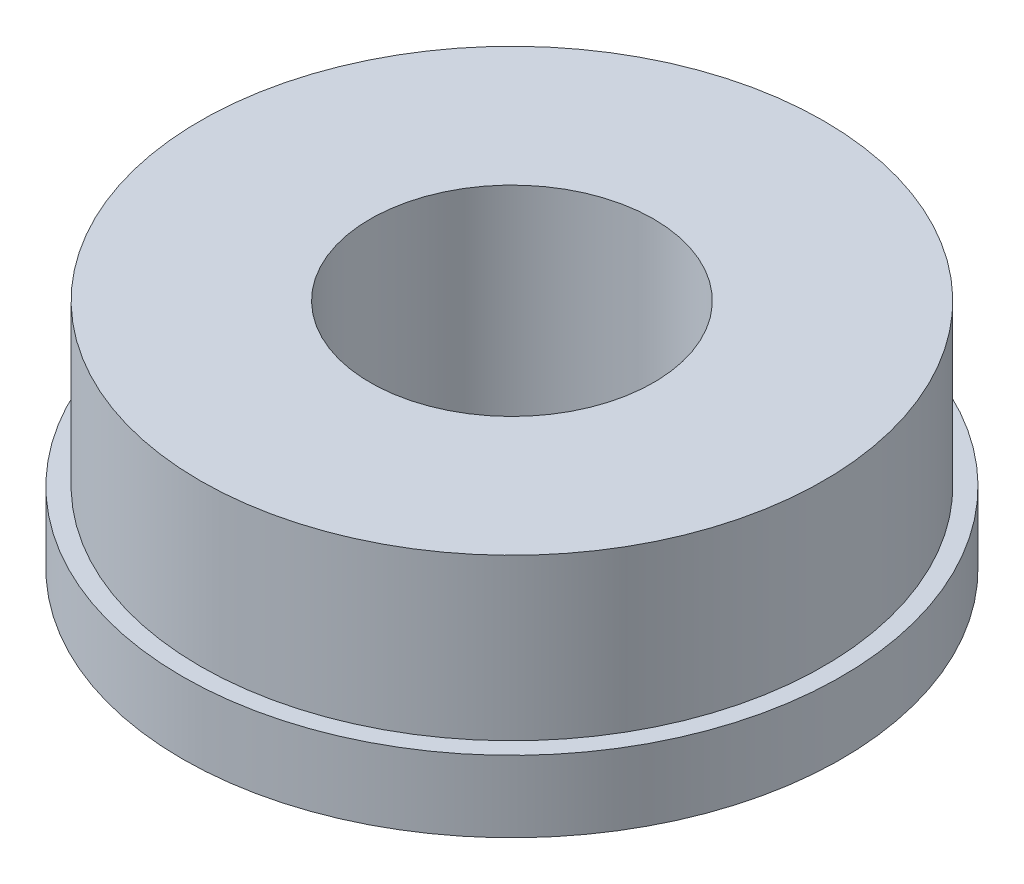
ISO-10303-21;
HEADER;
FILE_DESCRIPTION(('STEP AP214'),'2;1');
FILE_NAME('part.step','',(''),(''),'','','');
FILE_SCHEMA(('AUTOMOTIVE_DESIGN { 1 0 10303 214 1 1 1 1 }'));
ENDSEC;
DATA;
#1=APPLICATION_CONTEXT('core data for automotive mechanical design processes');
#2=APPLICATION_PROTOCOL_DEFINITION('international standard','automotive_design',2000,#1);
#3=PRODUCT_CONTEXT('',#1,'mechanical');
#4=PRODUCT('Part','Part','',(#3));
#5=PRODUCT_RELATED_PRODUCT_CATEGORY('part','',(#4));
#6=PRODUCT_DEFINITION_FORMATION('','',#4);
#7=PRODUCT_DEFINITION_CONTEXT('part definition',#1,'design');
#8=PRODUCT_DEFINITION('design','',#6,#7);
#9=PRODUCT_DEFINITION_SHAPE('','',#8);
#10=(LENGTH_UNIT() NAMED_UNIT(*) SI_UNIT(.MILLI.,.METRE.));
#11=(NAMED_UNIT(*) PLANE_ANGLE_UNIT() SI_UNIT($,.RADIAN.));
#12=(NAMED_UNIT(*) SI_UNIT($,.STERADIAN.) SOLID_ANGLE_UNIT());
#13=UNCERTAINTY_MEASURE_WITH_UNIT(LENGTH_MEASURE(1.E-05),#10,'distance_accuracy_value','');
#14=(GEOMETRIC_REPRESENTATION_CONTEXT(3) GLOBAL_UNCERTAINTY_ASSIGNED_CONTEXT((#13)) GLOBAL_UNIT_ASSIGNED_CONTEXT((#10,
#11,#12)) REPRESENTATION_CONTEXT('',''));
#15=CARTESIAN_POINT('',(0.,0.,0.));
#16=DIRECTION('',(0.,0.,1.));
#17=DIRECTION('',(1.,0.,0.));
#18=AXIS2_PLACEMENT_3D('',#15,#16,#17);
#19=CARTESIAN_POINT('',(0.,13.,0.));
#20=DIRECTION('',(0.,1.,0.));
#21=DIRECTION('',(0.,0.,1.));
#22=AXIS2_PLACEMENT_3D('',#19,#20,#21);
#23=PLANE('',#22);
#24=CARTESIAN_POINT('',(0.,13.,0.));
#25=DIRECTION('',(0.,1.,0.));
#26=DIRECTION('',(0.,0.,1.));
#27=AXIS2_PLACEMENT_3D('',#24,#25,#26);
#28=CIRCLE('',#27,17.465);
#29=CARTESIAN_POINT('',(0.,13.,-17.465));
#30=VERTEX_POINT('',#29);
#31=EDGE_CURVE('E10',#30,#30,#28,.T.);
#32=ORIENTED_EDGE('',*,*,#31,.T.);
#33=EDGE_LOOP('',(#32));
#34=FACE_BOUND('',#33,.T.);
#35=CARTESIAN_POINT('',(0.,13.,0.));
#36=DIRECTION('',(0.,1.,0.));
#37=DIRECTION('',(0.,0.,1.));
#38=AXIS2_PLACEMENT_3D('',#35,#36,#37);
#39=CIRCLE('',#38,7.94);
#40=CARTESIAN_POINT('',(0.,13.,-7.94));
#41=VERTEX_POINT('',#40);
#42=EDGE_CURVE('E42',#41,#41,#39,.T.);
#43=ORIENTED_EDGE('',*,*,#42,.F.);
#44=EDGE_LOOP('',(#43));
#45=FACE_BOUND('',#44,.T.);
#46=ADVANCED_FACE('F40',(#34,#45),#23,.T.);
#47=CARTESIAN_POINT('',(0.,0.,0.));
#48=DIRECTION('',(0.,1.,0.));
#49=DIRECTION('',(0.,0.,1.));
#50=AXIS2_PLACEMENT_3D('',#47,#48,#49);
#51=PLANE('',#50);
#52=CARTESIAN_POINT('',(0.,0.,0.));
#53=DIRECTION('',(0.,1.,0.));
#54=DIRECTION('',(0.,0.,1.));
#55=AXIS2_PLACEMENT_3D('',#52,#53,#54);
#56=CIRCLE('',#55,7.94);
#57=CARTESIAN_POINT('',(0.,0.,-7.94));
#58=VERTEX_POINT('',#57);
#59=EDGE_CURVE('E48',#58,#58,#56,.T.);
#60=ORIENTED_EDGE('',*,*,#59,.T.);
#61=EDGE_LOOP('',(#60));
#62=FACE_BOUND('',#61,.T.);
#63=CARTESIAN_POINT('',(0.,0.,0.));
#64=DIRECTION('',(0.,1.,0.));
#65=DIRECTION('',(0.,0.,1.));
#66=AXIS2_PLACEMENT_3D('',#63,#64,#65);
#67=CIRCLE('',#66,18.465);
#68=CARTESIAN_POINT('',(0.,0.,18.465));
#69=VERTEX_POINT('',#68);
#70=EDGE_CURVE('E59',#69,#69,#67,.T.);
#71=ORIENTED_EDGE('',*,*,#70,.F.);
#72=EDGE_LOOP('',(#71));
#73=FACE_BOUND('',#72,.T.);
#74=ADVANCED_FACE('F71',(#62,#73),#51,.F.);
#75=CARTESIAN_POINT('',(0.,13.,0.));
#76=DIRECTION('',(0.,-1.,0.));
#77=DIRECTION('',(0.,0.,-1.));
#78=AXIS2_PLACEMENT_3D('',#75,#76,#77);
#79=CYLINDRICAL_SURFACE('',#78,17.465);
#80=CARTESIAN_POINT('',(0.,4.,0.));
#81=DIRECTION('',(0.,1.,0.));
#82=DIRECTION('',(0.,0.,1.));
#83=AXIS2_PLACEMENT_3D('',#80,#81,#82);
#84=CIRCLE('',#83,17.465);
#85=CARTESIAN_POINT('',(0.,4.,-17.465));
#86=VERTEX_POINT('',#85);
#87=EDGE_CURVE('E52',#86,#86,#84,.T.);
#88=CARTESIAN_POINT('',(0.,4.,-17.465));
#89=CARTESIAN_POINT('',(0.,4.09375,-17.465));
#90=CARTESIAN_POINT('',(0.,4.1875,-17.465));
#91=CARTESIAN_POINT('',(0.,4.375,-17.465));
#92=CARTESIAN_POINT('',(0.,4.46875,-17.465));
#93=CARTESIAN_POINT('',(0.,4.65625,-17.465));
#94=CARTESIAN_POINT('',(0.,4.75,-17.465));
#95=CARTESIAN_POINT('',(0.,4.9375,-17.465));
#96=CARTESIAN_POINT('',(0.,5.03125,-17.465));
#97=CARTESIAN_POINT('',(0.,5.21875,-17.465));
#98=CARTESIAN_POINT('',(0.,5.3125,-17.465));
#99=CARTESIAN_POINT('',(0.,5.5,-17.465));
#100=CARTESIAN_POINT('',(0.,5.59375,-17.465));
#101=CARTESIAN_POINT('',(0.,5.78125,-17.465));
#102=CARTESIAN_POINT('',(0.,5.875,-17.465));
#103=CARTESIAN_POINT('',(0.,6.0625,-17.465));
#104=CARTESIAN_POINT('',(0.,6.15625,-17.465));
#105=CARTESIAN_POINT('',(0.,6.34375,-17.465));
#106=CARTESIAN_POINT('',(0.,6.4375,-17.465));
#107=CARTESIAN_POINT('',(0.,6.625,-17.465));
#108=CARTESIAN_POINT('',(0.,6.71875,-17.465));
#109=CARTESIAN_POINT('',(0.,6.90625,-17.465));
#110=CARTESIAN_POINT('',(0.,7.,-17.465));
#111=CARTESIAN_POINT('',(0.,7.1875,-17.465));
#112=CARTESIAN_POINT('',(0.,7.28125,-17.465));
#113=CARTESIAN_POINT('',(0.,7.46875,-17.465));
#114=CARTESIAN_POINT('',(0.,7.5625,-17.465));
#115=CARTESIAN_POINT('',(0.,7.75,-17.465));
#116=CARTESIAN_POINT('',(0.,7.84375,-17.465));
#117=CARTESIAN_POINT('',(0.,8.03125,-17.465));
#118=CARTESIAN_POINT('',(0.,8.125,-17.465));
#119=CARTESIAN_POINT('',(0.,8.3125,-17.465));
#120=CARTESIAN_POINT('',(0.,8.40625,-17.465));
#121=CARTESIAN_POINT('',(0.,8.59375,-17.465));
#122=CARTESIAN_POINT('',(0.,8.6875,-17.465));
#123=CARTESIAN_POINT('',(0.,8.875,-17.465));
#124=CARTESIAN_POINT('',(0.,8.96875,-17.465));
#125=CARTESIAN_POINT('',(0.,9.15625,-17.465));
#126=CARTESIAN_POINT('',(0.,9.25,-17.465));
#127=CARTESIAN_POINT('',(0.,9.4375,-17.465));
#128=CARTESIAN_POINT('',(0.,9.53125,-17.465));
#129=CARTESIAN_POINT('',(0.,9.71875,-17.465));
#130=CARTESIAN_POINT('',(0.,9.8125,-17.465));
#131=CARTESIAN_POINT('',(0.,10.,-17.465));
#132=CARTESIAN_POINT('',(0.,10.09375,-17.465));
#133=CARTESIAN_POINT('',(0.,10.28125,-17.465));
#134=CARTESIAN_POINT('',(0.,10.375,-17.465));
#135=CARTESIAN_POINT('',(0.,10.5625,-17.465));
#136=CARTESIAN_POINT('',(0.,10.65625,-17.465));
#137=CARTESIAN_POINT('',(0.,10.84375,-17.465));
#138=CARTESIAN_POINT('',(0.,10.9375,-17.465));
#139=CARTESIAN_POINT('',(0.,11.125,-17.465));
#140=CARTESIAN_POINT('',(0.,11.21875,-17.465));
#141=CARTESIAN_POINT('',(0.,11.40625,-17.465));
#142=CARTESIAN_POINT('',(0.,11.5,-17.465));
#143=CARTESIAN_POINT('',(0.,11.6875,-17.465));
#144=CARTESIAN_POINT('',(0.,11.78125,-17.465));
#145=CARTESIAN_POINT('',(0.,11.96875,-17.465));
#146=CARTESIAN_POINT('',(0.,12.0625,-17.465));
#147=CARTESIAN_POINT('',(0.,12.25,-17.465));
#148=CARTESIAN_POINT('',(0.,12.34375,-17.465));
#149=CARTESIAN_POINT('',(0.,12.53125,-17.465));
#150=CARTESIAN_POINT('',(0.,12.625,-17.465));
#151=CARTESIAN_POINT('',(0.,12.8125,-17.465));
#152=CARTESIAN_POINT('',(0.,12.90625,-17.465));
#153=CARTESIAN_POINT('',(0.,13.,-17.465));
#154=B_SPLINE_CURVE_WITH_KNOTS('',3,(#88,#89,#90,#91,#92,#93,#94,#95,#96,#97,#98,#99,#100,#101,
#102,#103,#104,#105,#106,#107,#108,#109,#110,#111,#112,#113,#114,#115,#116,#117,#118,#119,#120,
#121,#122,#123,#124,#125,#126,#127,#128,#129,#130,#131,#132,#133,#134,#135,#136,#137,#138,#139,
#140,#141,#142,#143,#144,#145,#146,#147,#148,#149,#150,#151,#152,#153),.UNSPECIFIED.,.F.,.F.,(4,
2,2,2,2,2,2,2,2,2,2,2,2,2,2,2,2,2,2,2,2,2,2,2,2,2,2,2,2,2,2,2,4),(0.,0.28125,0.5625,
0.843750000000001,1.125,1.40625,1.6875,1.96875,2.25,2.53125,2.8125,3.09375,3.375,3.65625,3.9375,
4.21875,4.5,4.78125,5.0625,5.34375,5.625,5.90625,6.1875,6.46875,6.75,7.03125,7.3125,7.59375,
7.875,8.15625,8.4375,8.71875,9.),.UNSPECIFIED.);
#155=EDGE_CURVE('BSEAM39',#86,#30,#154,.T.);
#156=ORIENTED_EDGE('',*,*,#87,.T.);
#157=ORIENTED_EDGE('',*,*,#31,.F.);
#158=ORIENTED_EDGE('',*,*,#155,.T.);
#159=ORIENTED_EDGE('',*,*,#155,.F.);
#160=EDGE_LOOP('',(#156,#158,#157,#159));
#161=FACE_BOUND('',#160,.T.);
#162=ADVANCED_FACE('F39',(#161),#79,.T.);
#163=CARTESIAN_POINT('',(0.,13.,0.));
#164=DIRECTION('',(0.,-1.,0.));
#165=DIRECTION('',(0.,0.,-1.));
#166=AXIS2_PLACEMENT_3D('',#163,#164,#165);
#167=CYLINDRICAL_SURFACE('',#166,7.94);
#168=CARTESIAN_POINT('',(0.,13.,-7.94));
#169=CARTESIAN_POINT('',(0.,12.8645833333333,-7.94));
#170=CARTESIAN_POINT('',(0.,12.7291666666667,-7.94));
#171=CARTESIAN_POINT('',(0.,12.4583333333333,-7.94));
#172=CARTESIAN_POINT('',(0.,12.3229166666667,-7.94));
#173=CARTESIAN_POINT('',(0.,12.0520833333333,-7.94));
#174=CARTESIAN_POINT('',(0.,11.9166666666667,-7.94));
#175=CARTESIAN_POINT('',(0.,11.6458333333333,-7.94));
#176=CARTESIAN_POINT('',(0.,11.5104166666667,-7.94));
#177=CARTESIAN_POINT('',(0.,11.2395833333333,-7.94));
#178=CARTESIAN_POINT('',(0.,11.1041666666667,-7.94));
#179=CARTESIAN_POINT('',(0.,10.8333333333333,-7.94));
#180=CARTESIAN_POINT('',(0.,10.6979166666667,-7.94));
#181=CARTESIAN_POINT('',(0.,10.4270833333333,-7.94));
#182=CARTESIAN_POINT('',(0.,10.2916666666667,-7.94));
#183=CARTESIAN_POINT('',(0.,10.0208333333333,-7.94));
#184=CARTESIAN_POINT('',(0.,9.88541666666667,-7.94));
#185=CARTESIAN_POINT('',(0.,9.61458333333333,-7.94));
#186=CARTESIAN_POINT('',(0.,9.47916666666667,-7.94));
#187=CARTESIAN_POINT('',(0.,9.20833333333333,-7.94));
#188=CARTESIAN_POINT('',(0.,9.07291666666666,-7.94));
#189=CARTESIAN_POINT('',(0.,8.80208333333333,-7.94));
#190=CARTESIAN_POINT('',(0.,8.66666666666667,-7.94));
#191=CARTESIAN_POINT('',(0.,8.39583333333333,-7.94));
#192=CARTESIAN_POINT('',(0.,8.26041666666667,-7.94));
#193=CARTESIAN_POINT('',(0.,7.98958333333333,-7.94));
#194=CARTESIAN_POINT('',(0.,7.85416666666667,-7.94));
#195=CARTESIAN_POINT('',(0.,7.58333333333333,-7.94));
#196=CARTESIAN_POINT('',(0.,7.44791666666667,-7.94));
#197=CARTESIAN_POINT('',(0.,7.17708333333333,-7.94));
#198=CARTESIAN_POINT('',(0.,7.04166666666667,-7.94));
#199=CARTESIAN_POINT('',(0.,6.77083333333333,-7.94));
#200=CARTESIAN_POINT('',(0.,6.63541666666667,-7.94));
#201=CARTESIAN_POINT('',(0.,6.36458333333333,-7.94));
#202=CARTESIAN_POINT('',(0.,6.22916666666667,-7.94));
#203=CARTESIAN_POINT('',(0.,5.95833333333333,-7.94));
#204=CARTESIAN_POINT('',(0.,5.82291666666667,-7.94));
#205=CARTESIAN_POINT('',(0.,5.55208333333333,-7.94));
#206=CARTESIAN_POINT('',(0.,5.41666666666667,-7.94));
#207=CARTESIAN_POINT('',(0.,5.14583333333333,-7.94));
#208=CARTESIAN_POINT('',(0.,5.01041666666667,-7.94));
#209=CARTESIAN_POINT('',(0.,4.73958333333333,-7.94));
#210=CARTESIAN_POINT('',(0.,4.60416666666667,-7.94));
#211=CARTESIAN_POINT('',(0.,4.33333333333333,-7.94));
#212=CARTESIAN_POINT('',(0.,4.19791666666667,-7.94));
#213=CARTESIAN_POINT('',(0.,3.92708333333333,-7.94));
#214=CARTESIAN_POINT('',(0.,3.79166666666667,-7.94));
#215=CARTESIAN_POINT('',(0.,3.52083333333333,-7.94));
#216=CARTESIAN_POINT('',(0.,3.38541666666667,-7.94));
#217=CARTESIAN_POINT('',(0.,3.11458333333333,-7.94));
#218=CARTESIAN_POINT('',(0.,2.97916666666667,-7.94));
#219=CARTESIAN_POINT('',(0.,2.70833333333333,-7.94));
#220=CARTESIAN_POINT('',(0.,2.57291666666667,-7.94));
#221=CARTESIAN_POINT('',(0.,2.30208333333333,-7.94));
#222=CARTESIAN_POINT('',(0.,2.16666666666667,-7.94));
#223=CARTESIAN_POINT('',(0.,1.89583333333333,-7.94));
#224=CARTESIAN_POINT('',(0.,1.76041666666667,-7.94));
#225=CARTESIAN_POINT('',(0.,1.48958333333333,-7.94));
#226=CARTESIAN_POINT('',(0.,1.35416666666667,-7.94));
#227=CARTESIAN_POINT('',(0.,1.08333333333333,-7.94));
#228=CARTESIAN_POINT('',(0.,0.947916666666667,-7.94));
#229=CARTESIAN_POINT('',(0.,0.677083333333334,-7.94));
#230=CARTESIAN_POINT('',(0.,0.541666666666667,-7.94));
#231=CARTESIAN_POINT('',(0.,0.270833333333334,-7.94));
#232=CARTESIAN_POINT('',(0.,0.135416666666667,-7.94));
#233=CARTESIAN_POINT('',(0.,0.,-7.94));
#234=B_SPLINE_CURVE_WITH_KNOTS('',3,(#168,#169,#170,#171,#172,#173,#174,#175,#176,#177,#178,
#179,#180,#181,#182,#183,#184,#185,#186,#187,#188,#189,#190,#191,#192,#193,#194,#195,#196,#197,
#198,#199,#200,#201,#202,#203,#204,#205,#206,#207,#208,#209,#210,#211,#212,#213,#214,#215,#216,
#217,#218,#219,#220,#221,#222,#223,#224,#225,#226,#227,#228,#229,#230,#231,#232,#233),
.UNSPECIFIED.,.F.,.F.,(4,2,2,2,2,2,2,2,2,2,2,2,2,2,2,2,2,2,2,2,2,2,2,2,2,2,2,2,2,2,2,2,4),(0.,
0.40625,0.812500000000001,1.21875,1.625,2.03125,2.4375,2.84375,3.25,3.65625,4.0625,4.46875,
4.875,5.28125,5.6875,6.09375,6.5,6.90625,7.3125,7.71875,8.125,8.53125,8.9375,9.34375,9.75,
10.15625,10.5625,10.96875,11.375,11.78125,12.1875,12.59375,13.),.UNSPECIFIED.);
#235=EDGE_CURVE('BSEAM79',#41,#58,#234,.T.);
#236=ORIENTED_EDGE('',*,*,#42,.T.);
#237=ORIENTED_EDGE('',*,*,#59,.F.);
#238=ORIENTED_EDGE('',*,*,#235,.T.);
#239=ORIENTED_EDGE('',*,*,#235,.F.);
#240=EDGE_LOOP('',(#236,#238,#237,#239));
#241=FACE_BOUND('',#240,.T.);
#242=ADVANCED_FACE('F79',(#241),#167,.F.);
#243=CARTESIAN_POINT('',(0.,4.,0.));
#244=DIRECTION('',(0.,1.,0.));
#245=DIRECTION('',(0.,0.,1.));
#246=AXIS2_PLACEMENT_3D('',#243,#244,#245);
#247=PLANE('',#246);
#248=CARTESIAN_POINT('',(0.,4.,0.));
#249=DIRECTION('',(0.,1.,0.));
#250=DIRECTION('',(0.,0.,1.));
#251=AXIS2_PLACEMENT_3D('',#248,#249,#250);
#252=CIRCLE('',#251,18.465);
#253=CARTESIAN_POINT('',(0.,4.,18.465));
#254=VERTEX_POINT('',#253);
#255=EDGE_CURVE('E60',#254,#254,#252,.T.);
#256=ORIENTED_EDGE('',*,*,#255,.T.);
#257=EDGE_LOOP('',(#256));
#258=FACE_BOUND('',#257,.T.);
#259=ORIENTED_EDGE('',*,*,#87,.F.);
#260=EDGE_LOOP('',(#259));
#261=FACE_BOUND('',#260,.T.);
#262=ADVANCED_FACE('F63',(#258,#261),#247,.T.);
#263=CARTESIAN_POINT('',(0.,4.,0.));
#264=DIRECTION('',(0.,-1.,0.));
#265=DIRECTION('',(0.,0.,-1.));
#266=AXIS2_PLACEMENT_3D('',#263,#264,#265);
#267=CYLINDRICAL_SURFACE('',#266,18.465);
#268=ORIENTED_EDGE('',*,*,#255,.F.);
#269=EDGE_LOOP('',(#268));
#270=FACE_BOUND('',#269,.T.);
#271=ORIENTED_EDGE('',*,*,#70,.T.);
#272=EDGE_LOOP('',(#271));
#273=FACE_BOUND('',#272,.T.);
#274=ADVANCED_FACE('F67',(#270,#273),#267,.T.);
#275=CLOSED_SHELL('',(#46,#74,#162,#242,#262,#274));
#276=MANIFOLD_SOLID_BREP('B2',#275);
#277=ADVANCED_BREP_SHAPE_REPRESENTATION('',(#18,#276),#14);
#278=SHAPE_DEFINITION_REPRESENTATION(#9,#277);
ENDSEC;
END-ISO-10303-21;
